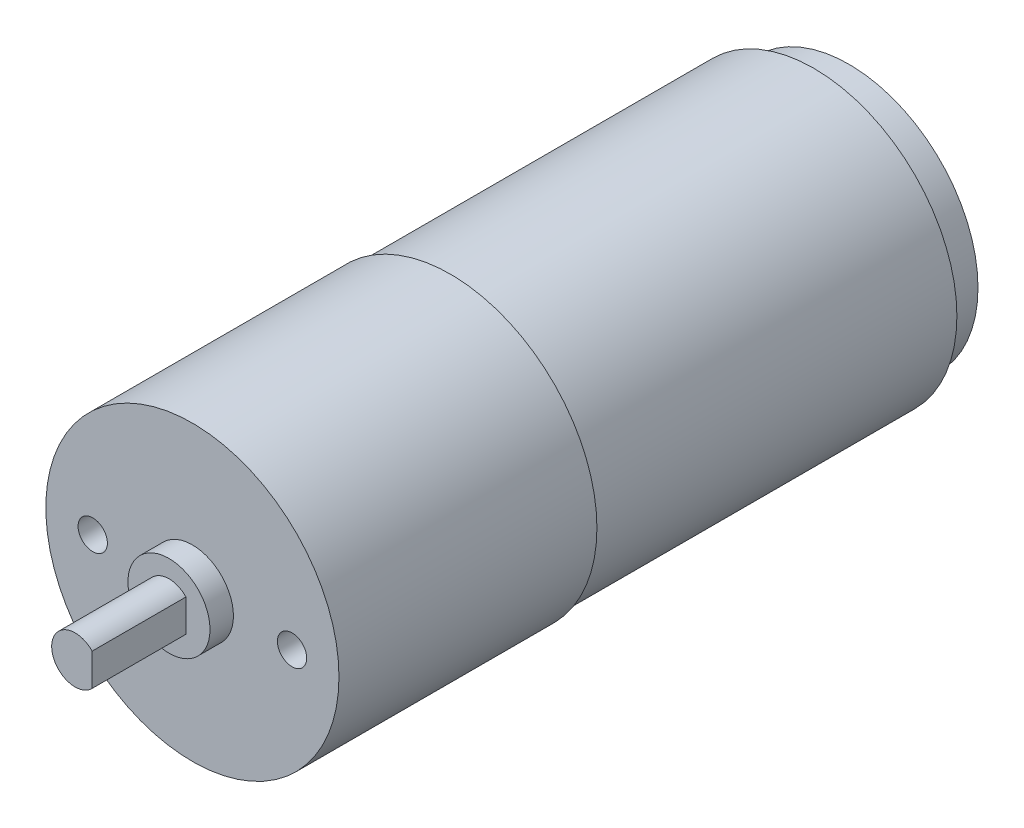
ISO-10303-21;
HEADER;
FILE_DESCRIPTION(('STEP AP214'),'2;1');
FILE_NAME('part.step','',(''),(''),'','','');
FILE_SCHEMA(('AUTOMOTIVE_DESIGN { 1 0 10303 214 1 1 1 1 }'));
ENDSEC;
DATA;
#1=APPLICATION_CONTEXT('core data for automotive mechanical design processes');
#2=APPLICATION_PROTOCOL_DEFINITION('international standard','automotive_design',2000,#1);
#3=PRODUCT_CONTEXT('',#1,'mechanical');
#4=PRODUCT('Part','Part','',(#3));
#5=PRODUCT_RELATED_PRODUCT_CATEGORY('part','',(#4));
#6=PRODUCT_DEFINITION_FORMATION('','',#4);
#7=PRODUCT_DEFINITION_CONTEXT('part definition',#1,'design');
#8=PRODUCT_DEFINITION('design','',#6,#7);
#9=PRODUCT_DEFINITION_SHAPE('','',#8);
#10=(LENGTH_UNIT() NAMED_UNIT(*) SI_UNIT(.MILLI.,.METRE.));
#11=(NAMED_UNIT(*) PLANE_ANGLE_UNIT() SI_UNIT($,.RADIAN.));
#12=(NAMED_UNIT(*) SI_UNIT($,.STERADIAN.) SOLID_ANGLE_UNIT());
#13=UNCERTAINTY_MEASURE_WITH_UNIT(LENGTH_MEASURE(1.E-05),#10,'distance_accuracy_value','');
#14=(GEOMETRIC_REPRESENTATION_CONTEXT(3) GLOBAL_UNCERTAINTY_ASSIGNED_CONTEXT((#13)) GLOBAL_UNIT_ASSIGNED_CONTEXT((#10,
#11,#12)) REPRESENTATION_CONTEXT('',''));
#15=CARTESIAN_POINT('',(0.,0.,0.));
#16=DIRECTION('',(0.,0.,1.));
#17=DIRECTION('',(1.,0.,0.));
#18=AXIS2_PLACEMENT_3D('',#15,#16,#17);
#19=CARTESIAN_POINT('',(0.,0.,0.));
#20=DIRECTION('',(0.,0.,-1.));
#21=DIRECTION('',(-1.,0.,0.));
#22=AXIS2_PLACEMENT_3D('',#19,#20,#21);
#23=CYLINDRICAL_SURFACE('',#22,12.5);
#24=CARTESIAN_POINT('',(0.,0.,0.));
#25=DIRECTION('',(0.,0.,1.));
#26=DIRECTION('',(1.,0.,0.));
#27=AXIS2_PLACEMENT_3D('',#24,#25,#26);
#28=CIRCLE('',#27,12.5);
#29=CARTESIAN_POINT('',(12.5,0.,0.));
#30=VERTEX_POINT('',#29);
#31=EDGE_CURVE('E50',#30,#30,#28,.T.);
#32=ORIENTED_EDGE('',*,*,#31,.F.);
#33=EDGE_LOOP('',(#32));
#34=FACE_BOUND('',#33,.T.);
#35=CARTESIAN_POINT('',(0.,0.,-22.));
#36=DIRECTION('',(0.,0.,1.));
#37=DIRECTION('',(1.,0.,0.));
#38=AXIS2_PLACEMENT_3D('',#35,#36,#37);
#39=CIRCLE('',#38,12.5);
#40=CARTESIAN_POINT('',(12.5,0.,-22.));
#41=VERTEX_POINT('',#40);
#42=EDGE_CURVE('E45',#41,#41,#39,.T.);
#43=ORIENTED_EDGE('',*,*,#42,.T.);
#44=EDGE_LOOP('',(#43));
#45=FACE_BOUND('',#44,.T.);
#46=ADVANCED_FACE('F39',(#34,#45),#23,.T.);
#47=CARTESIAN_POINT('',(0.,0.,0.));
#48=DIRECTION('',(0.,0.,1.));
#49=DIRECTION('',(1.,0.,0.));
#50=AXIS2_PLACEMENT_3D('',#47,#48,#49);
#51=PLANE('',#50);
#52=CARTESIAN_POINT('',(-8.5,0.,0.));
#53=DIRECTION('',(0.,0.,1.));
#54=DIRECTION('',(1.,0.,0.));
#55=AXIS2_PLACEMENT_3D('',#52,#53,#54);
#56=CIRCLE('',#55,1.25);
#57=CARTESIAN_POINT('',(-7.25,0.,0.));
#58=VERTEX_POINT('',#57);
#59=EDGE_CURVE('E257',#58,#58,#56,.T.);
#60=ORIENTED_EDGE('',*,*,#59,.F.);
#61=EDGE_LOOP('',(#60));
#62=FACE_BOUND('',#61,.T.);
#63=CARTESIAN_POINT('',(8.5,0.,0.));
#64=DIRECTION('',(0.,0.,1.));
#65=DIRECTION('',(1.,0.,0.));
#66=AXIS2_PLACEMENT_3D('',#63,#64,#65);
#67=CIRCLE('',#66,1.25);
#68=CARTESIAN_POINT('',(9.75,0.,0.));
#69=VERTEX_POINT('',#68);
#70=EDGE_CURVE('E263',#69,#69,#67,.T.);
#71=ORIENTED_EDGE('',*,*,#70,.F.);
#72=EDGE_LOOP('',(#71));
#73=FACE_BOUND('',#72,.T.);
#74=CARTESIAN_POINT('',(0.,0.,0.));
#75=DIRECTION('',(0.,0.,1.));
#76=DIRECTION('',(1.,0.,0.));
#77=AXIS2_PLACEMENT_3D('',#74,#75,#76);
#78=CIRCLE('',#77,3.5);
#79=CARTESIAN_POINT('',(3.5,0.,0.));
#80=VERTEX_POINT('',#79);
#81=EDGE_CURVE('E11',#80,#80,#78,.T.);
#82=ORIENTED_EDGE('',*,*,#81,.F.);
#83=EDGE_LOOP('',(#82));
#84=FACE_BOUND('',#83,.T.);
#85=ORIENTED_EDGE('',*,*,#31,.T.);
#86=EDGE_LOOP('',(#85));
#87=FACE_BOUND('',#86,.T.);
#88=ADVANCED_FACE('F112',(#62,#73,#84,#87),#51,.T.);
#89=CARTESIAN_POINT('',(0.,0.,-22.));
#90=DIRECTION('',(0.,0.,1.));
#91=DIRECTION('',(1.,0.,0.));
#92=AXIS2_PLACEMENT_3D('',#89,#90,#91);
#93=PLANE('',#92);
#94=CARTESIAN_POINT('',(0.,0.,-22.));
#95=DIRECTION('',(0.,0.,1.));
#96=DIRECTION('',(1.,0.,0.));
#97=AXIS2_PLACEMENT_3D('',#94,#95,#96);
#98=CIRCLE('',#97,12.2);
#99=CARTESIAN_POINT('',(12.2,0.,-22.));
#100=VERTEX_POINT('',#99);
#101=EDGE_CURVE('E100',#100,#100,#98,.T.);
#102=ORIENTED_EDGE('',*,*,#101,.T.);
#103=EDGE_LOOP('',(#102));
#104=FACE_BOUND('',#103,.T.);
#105=ORIENTED_EDGE('',*,*,#42,.F.);
#106=EDGE_LOOP('',(#105));
#107=FACE_BOUND('',#106,.T.);
#108=ADVANCED_FACE('F107',(#104,#107),#93,.F.);
#109=CARTESIAN_POINT('',(0.,0.,-22.));
#110=DIRECTION('',(0.,0.,-1.));
#111=DIRECTION('',(-1.,0.,0.));
#112=AXIS2_PLACEMENT_3D('',#109,#110,#111);
#113=CYLINDRICAL_SURFACE('',#112,12.2);
#114=ORIENTED_EDGE('',*,*,#101,.F.);
#115=EDGE_LOOP('',(#114));
#116=FACE_BOUND('',#115,.T.);
#117=CARTESIAN_POINT('',(0.,0.,-53.));
#118=DIRECTION('',(0.,0.,1.));
#119=DIRECTION('',(1.,0.,0.));
#120=AXIS2_PLACEMENT_3D('',#117,#118,#119);
#121=CIRCLE('',#120,12.2);
#122=CARTESIAN_POINT('',(12.2,0.,-53.));
#123=VERTEX_POINT('',#122);
#124=EDGE_CURVE('E94',#123,#123,#121,.T.);
#125=ORIENTED_EDGE('',*,*,#124,.T.);
#126=EDGE_LOOP('',(#125));
#127=FACE_BOUND('',#126,.T.);
#128=ADVANCED_FACE('F109',(#116,#127),#113,.T.);
#129=CARTESIAN_POINT('',(0.,0.,-53.));
#130=DIRECTION('',(0.,0.,1.));
#131=DIRECTION('',(1.,0.,0.));
#132=AXIS2_PLACEMENT_3D('',#129,#130,#131);
#133=PLANE('',#132);
#134=CARTESIAN_POINT('',(0.,0.,-53.));
#135=DIRECTION('',(0.,0.,1.));
#136=DIRECTION('',(1.,0.,0.));
#137=AXIS2_PLACEMENT_3D('',#134,#135,#136);
#138=CIRCLE('',#137,11.);
#139=CARTESIAN_POINT('',(11.,0.,-53.));
#140=VERTEX_POINT('',#139);
#141=EDGE_CURVE('E93',#140,#140,#138,.T.);
#142=ORIENTED_EDGE('',*,*,#141,.T.);
#143=EDGE_LOOP('',(#142));
#144=FACE_BOUND('',#143,.T.);
#145=ORIENTED_EDGE('',*,*,#124,.F.);
#146=EDGE_LOOP('',(#145));
#147=FACE_BOUND('',#146,.T.);
#148=ADVANCED_FACE('F120',(#144,#147),#133,.F.);
#149=CARTESIAN_POINT('',(0.,0.,-53.));
#150=DIRECTION('',(0.,0.,-1.));
#151=DIRECTION('',(-1.,0.,0.));
#152=AXIS2_PLACEMENT_3D('',#149,#150,#151);
#153=CYLINDRICAL_SURFACE('',#152,11.);
#154=ORIENTED_EDGE('',*,*,#141,.F.);
#155=EDGE_LOOP('',(#154));
#156=FACE_BOUND('',#155,.T.);
#157=CARTESIAN_POINT('',(0.,0.,-56.));
#158=DIRECTION('',(0.,0.,1.));
#159=DIRECTION('',(1.,0.,0.));
#160=AXIS2_PLACEMENT_3D('',#157,#158,#159);
#161=CIRCLE('',#160,11.);
#162=CARTESIAN_POINT('',(11.,0.,-56.));
#163=VERTEX_POINT('',#162);
#164=EDGE_CURVE('E90',#163,#163,#161,.T.);
#165=ORIENTED_EDGE('',*,*,#164,.T.);
#166=EDGE_LOOP('',(#165));
#167=FACE_BOUND('',#166,.T.);
#168=ADVANCED_FACE('F152',(#156,#167),#153,.T.);
#169=CARTESIAN_POINT('',(0.,0.,-56.));
#170=DIRECTION('',(0.,0.,1.));
#171=DIRECTION('',(1.,0.,0.));
#172=AXIS2_PLACEMENT_3D('',#169,#170,#171);
#173=PLANE('',#172);
#174=ORIENTED_EDGE('',*,*,#164,.F.);
#175=EDGE_LOOP('',(#174));
#176=FACE_BOUND('',#175,.T.);
#177=ADVANCED_FACE('F163',(#176),#173,.F.);
#178=CARTESIAN_POINT('',(0.,0.,2.));
#179=DIRECTION('',(0.,0.,-1.));
#180=DIRECTION('',(-1.,0.,0.));
#181=AXIS2_PLACEMENT_3D('',#178,#179,#180);
#182=CYLINDRICAL_SURFACE('',#181,3.5);
#183=CARTESIAN_POINT('',(0.,0.,2.));
#184=DIRECTION('',(0.,0.,1.));
#185=DIRECTION('',(1.,0.,0.));
#186=AXIS2_PLACEMENT_3D('',#183,#184,#185);
#187=CIRCLE('',#186,3.5);
#188=CARTESIAN_POINT('',(3.5,0.,2.));
#189=VERTEX_POINT('',#188);
#190=EDGE_CURVE('E84',#189,#189,#187,.T.);
#191=ORIENTED_EDGE('',*,*,#190,.F.);
#192=EDGE_LOOP('',(#191));
#193=FACE_BOUND('',#192,.T.);
#194=ORIENTED_EDGE('',*,*,#81,.T.);
#195=EDGE_LOOP('',(#194));
#196=FACE_BOUND('',#195,.T.);
#197=ADVANCED_FACE('F173',(#193,#196),#182,.T.);
#198=CARTESIAN_POINT('',(0.,0.,2.));
#199=DIRECTION('',(0.,0.,1.));
#200=DIRECTION('',(1.,0.,0.));
#201=AXIS2_PLACEMENT_3D('',#198,#199,#200);
#202=PLANE('',#201);
#203=CARTESIAN_POINT('',(0.,0.,2.));
#204=DIRECTION('',(0.,0.,1.));
#205=DIRECTION('',(1.,0.,0.));
#206=AXIS2_PLACEMENT_3D('',#203,#204,#205);
#207=CIRCLE('',#206,2.);
#208=CARTESIAN_POINT('',(1.45,1.37749773139559,2.));
#209=VERTEX_POINT('',#208);
#210=CARTESIAN_POINT('',(1.45,-1.37749773139559,2.));
#211=VERTEX_POINT('',#210);
#212=EDGE_CURVE('E70',#209,#211,#207,.T.);
#213=ORIENTED_EDGE('',*,*,#212,.F.);
#214=DIRECTION('',(0.,1.,0.));
#215=VECTOR('',#214,1.);
#216=CARTESIAN_POINT('',(1.45,-1.37749773139559,2.));
#217=LINE('',#216,#215);
#218=EDGE_CURVE('E53',#211,#209,#217,.T.);
#219=ORIENTED_EDGE('',*,*,#218,.F.);
#220=EDGE_LOOP('',(#213,#219));
#221=FACE_BOUND('',#220,.T.);
#222=ORIENTED_EDGE('',*,*,#190,.T.);
#223=EDGE_LOOP('',(#222));
#224=FACE_BOUND('',#223,.T.);
#225=ADVANCED_FACE('F68',(#221,#224),#202,.T.);
#226=CARTESIAN_POINT('',(0.,0.,10.));
#227=DIRECTION('',(0.,0.,-1.));
#228=DIRECTION('',(-1.,0.,0.));
#229=AXIS2_PLACEMENT_3D('',#226,#227,#228);
#230=CYLINDRICAL_SURFACE('',#229,2.);
#231=ORIENTED_EDGE('',*,*,#212,.T.);
#232=DIRECTION('',(0.,0.,-1.));
#233=VECTOR('',#232,1.);
#234=CARTESIAN_POINT('',(1.45,-1.37749773139559,10.));
#235=LINE('',#234,#233);
#236=CARTESIAN_POINT('',(1.45,-1.37749773139559,10.));
#237=VERTEX_POINT('',#236);
#238=EDGE_CURVE('E78',#237,#211,#235,.T.);
#239=ORIENTED_EDGE('',*,*,#238,.F.);
#240=CARTESIAN_POINT('',(0.,0.,10.));
#241=DIRECTION('',(0.,0.,1.));
#242=DIRECTION('',(1.,0.,0.));
#243=AXIS2_PLACEMENT_3D('',#240,#241,#242);
#244=CIRCLE('',#243,2.);
#245=CARTESIAN_POINT('',(1.45,1.37749773139559,10.));
#246=VERTEX_POINT('',#245);
#247=EDGE_CURVE('E79',#246,#237,#244,.T.);
#248=ORIENTED_EDGE('',*,*,#247,.F.);
#249=DIRECTION('',(0.,0.,-1.));
#250=VECTOR('',#249,1.);
#251=CARTESIAN_POINT('',(1.45,1.37749773139559,10.));
#252=LINE('',#251,#250);
#253=EDGE_CURVE('E80',#246,#209,#252,.T.);
#254=ORIENTED_EDGE('',*,*,#253,.T.);
#255=EDGE_LOOP('',(#231,#239,#248,#254));
#256=FACE_BOUND('',#255,.T.);
#257=ADVANCED_FACE('F85',(#256),#230,.T.);
#258=CARTESIAN_POINT('',(1.45,-1.37749773139559,10.));
#259=DIRECTION('',(-1.,0.,0.));
#260=DIRECTION('',(0.,-1.,0.));
#261=AXIS2_PLACEMENT_3D('',#258,#259,#260);
#262=PLANE('',#261);
#263=ORIENTED_EDGE('',*,*,#218,.T.);
#264=ORIENTED_EDGE('',*,*,#253,.F.);
#265=DIRECTION('',(0.,1.,0.));
#266=VECTOR('',#265,1.);
#267=CARTESIAN_POINT('',(1.45,-1.37749773139559,10.));
#268=LINE('',#267,#266);
#269=EDGE_CURVE('E65',#237,#246,#268,.T.);
#270=ORIENTED_EDGE('',*,*,#269,.F.);
#271=ORIENTED_EDGE('',*,*,#238,.T.);
#272=EDGE_LOOP('',(#263,#264,#270,#271));
#273=FACE_BOUND('',#272,.T.);
#274=ADVANCED_FACE('F76',(#273),#262,.F.);
#275=CARTESIAN_POINT('',(0.,0.,10.));
#276=DIRECTION('',(0.,0.,1.));
#277=DIRECTION('',(1.,0.,0.));
#278=AXIS2_PLACEMENT_3D('',#275,#276,#277);
#279=PLANE('',#278);
#280=ORIENTED_EDGE('',*,*,#247,.T.);
#281=ORIENTED_EDGE('',*,*,#269,.T.);
#282=EDGE_LOOP('',(#280,#281));
#283=FACE_BOUND('',#282,.T.);
#284=ADVANCED_FACE('F207',(#283),#279,.T.);
#285=CARTESIAN_POINT('',(8.5,0.,-5.));
#286=DIRECTION('',(0.,0.,1.));
#287=DIRECTION('',(1.,0.,0.));
#288=AXIS2_PLACEMENT_3D('',#285,#286,#287);
#289=CYLINDRICAL_SURFACE('',#288,1.25);
#290=CARTESIAN_POINT('',(8.5,0.,-5.));
#291=DIRECTION('',(0.,0.,1.));
#292=DIRECTION('',(1.,0.,0.));
#293=AXIS2_PLACEMENT_3D('',#290,#291,#292);
#294=CIRCLE('',#293,1.25);
#295=CARTESIAN_POINT('',(9.75,0.,-5.));
#296=VERTEX_POINT('',#295);
#297=EDGE_CURVE('E268',#296,#296,#294,.T.);
#298=ORIENTED_EDGE('',*,*,#297,.F.);
#299=EDGE_LOOP('',(#298));
#300=FACE_BOUND('',#299,.T.);
#301=ORIENTED_EDGE('',*,*,#70,.T.);
#302=EDGE_LOOP('',(#301));
#303=FACE_BOUND('',#302,.T.);
#304=ADVANCED_FACE('F220',(#300,#303),#289,.F.);
#305=CARTESIAN_POINT('',(8.5,0.,-5.));
#306=DIRECTION('',(0.,0.,1.));
#307=DIRECTION('',(1.,0.,0.));
#308=AXIS2_PLACEMENT_3D('',#305,#306,#307);
#309=PLANE('',#308);
#310=ORIENTED_EDGE('',*,*,#297,.T.);
#311=EDGE_LOOP('',(#310));
#312=FACE_BOUND('',#311,.T.);
#313=ADVANCED_FACE('F223',(#312),#309,.T.);
#314=CARTESIAN_POINT('',(-8.5,0.,-5.));
#315=DIRECTION('',(0.,0.,1.));
#316=DIRECTION('',(1.,0.,0.));
#317=AXIS2_PLACEMENT_3D('',#314,#315,#316);
#318=CYLINDRICAL_SURFACE('',#317,1.25);
#319=CARTESIAN_POINT('',(-8.5,0.,-5.));
#320=DIRECTION('',(0.,0.,1.));
#321=DIRECTION('',(1.,0.,0.));
#322=AXIS2_PLACEMENT_3D('',#319,#320,#321);
#323=CIRCLE('',#322,1.25);
#324=CARTESIAN_POINT('',(-7.25,0.,-5.));
#325=VERTEX_POINT('',#324);
#326=EDGE_CURVE('E71',#325,#325,#323,.T.);
#327=ORIENTED_EDGE('',*,*,#326,.F.);
#328=EDGE_LOOP('',(#327));
#329=FACE_BOUND('',#328,.T.);
#330=ORIENTED_EDGE('',*,*,#59,.T.);
#331=EDGE_LOOP('',(#330));
#332=FACE_BOUND('',#331,.T.);
#333=ADVANCED_FACE('F231',(#329,#332),#318,.F.);
#334=CARTESIAN_POINT('',(-8.5,0.,-5.));
#335=DIRECTION('',(0.,0.,1.));
#336=DIRECTION('',(1.,0.,0.));
#337=AXIS2_PLACEMENT_3D('',#334,#335,#336);
#338=PLANE('',#337);
#339=ORIENTED_EDGE('',*,*,#326,.T.);
#340=EDGE_LOOP('',(#339));
#341=FACE_BOUND('',#340,.T.);
#342=ADVANCED_FACE('F244',(#341),#338,.T.);
#343=CLOSED_SHELL('',(#46,#88,#108,#128,#148,#168,#177,#197,#225,#257,#274,#284,#304,#313,#333,#342));
#344=MANIFOLD_SOLID_BREP('B2',#343);
#345=ADVANCED_BREP_SHAPE_REPRESENTATION('',(#18,#344),#14);
#346=SHAPE_DEFINITION_REPRESENTATION(#9,#345);
ENDSEC;
END-ISO-10303-21;
